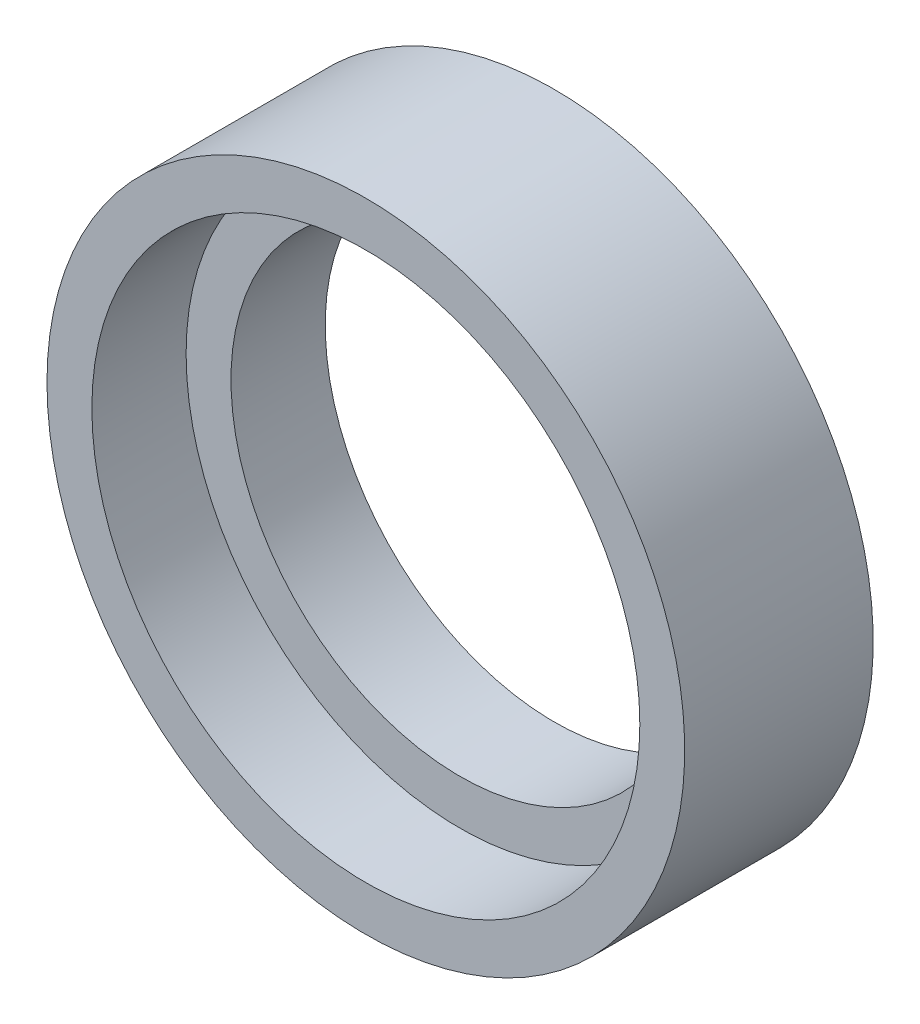
ISO-10303-21;
HEADER;
FILE_DESCRIPTION(('STEP AP214'),'2;1');
FILE_NAME('part.step','',(''),(''),'','','');
FILE_SCHEMA(('AUTOMOTIVE_DESIGN { 1 0 10303 214 1 1 1 1 }'));
ENDSEC;
DATA;
#1=APPLICATION_CONTEXT('core data for automotive mechanical design processes');
#2=APPLICATION_PROTOCOL_DEFINITION('international standard','automotive_design',2000,#1);
#3=PRODUCT_CONTEXT('',#1,'mechanical');
#4=PRODUCT('Part','Part','',(#3));
#5=PRODUCT_RELATED_PRODUCT_CATEGORY('part','',(#4));
#6=PRODUCT_DEFINITION_FORMATION('','',#4);
#7=PRODUCT_DEFINITION_CONTEXT('part definition',#1,'design');
#8=PRODUCT_DEFINITION('design','',#6,#7);
#9=PRODUCT_DEFINITION_SHAPE('','',#8);
#10=(LENGTH_UNIT() NAMED_UNIT(*) SI_UNIT(.MILLI.,.METRE.));
#11=(NAMED_UNIT(*) PLANE_ANGLE_UNIT() SI_UNIT($,.RADIAN.));
#12=(NAMED_UNIT(*) SI_UNIT($,.STERADIAN.) SOLID_ANGLE_UNIT());
#13=UNCERTAINTY_MEASURE_WITH_UNIT(LENGTH_MEASURE(1.E-05),#10,'distance_accuracy_value','');
#14=(GEOMETRIC_REPRESENTATION_CONTEXT(3) GLOBAL_UNCERTAINTY_ASSIGNED_CONTEXT((#13)) GLOBAL_UNIT_ASSIGNED_CONTEXT((#10,
#11,#12)) REPRESENTATION_CONTEXT('',''));
#15=CARTESIAN_POINT('',(0.,0.,0.));
#16=DIRECTION('',(0.,0.,1.));
#17=DIRECTION('',(1.,0.,0.));
#18=AXIS2_PLACEMENT_3D('',#15,#16,#17);
#19=CARTESIAN_POINT('',(0.,0.,21.));
#20=DIRECTION('',(0.,0.,1.));
#21=DIRECTION('',(1.,0.,0.));
#22=AXIS2_PLACEMENT_3D('',#19,#20,#21);
#23=PLANE('',#22);
#24=CARTESIAN_POINT('',(0.,0.,21.));
#25=DIRECTION('',(0.,0.,1.));
#26=DIRECTION('',(1.,0.,0.));
#27=AXIS2_PLACEMENT_3D('',#24,#25,#26);
#28=CIRCLE('',#27,71.05);
#29=CARTESIAN_POINT('',(-71.05,0.,21.));
#30=VERTEX_POINT('',#29);
#31=EDGE_CURVE('E10',#30,#30,#28,.T.);
#32=ORIENTED_EDGE('',*,*,#31,.T.);
#33=EDGE_LOOP('',(#32));
#34=FACE_BOUND('',#33,.T.);
#35=CARTESIAN_POINT('',(0.,0.,21.));
#36=DIRECTION('',(0.,0.,1.));
#37=DIRECTION('',(1.,0.,0.));
#38=AXIS2_PLACEMENT_3D('',#35,#36,#37);
#39=CIRCLE('',#38,61.05);
#40=CARTESIAN_POINT('',(-61.05,0.,21.));
#41=VERTEX_POINT('',#40);
#42=EDGE_CURVE('E42',#41,#41,#39,.T.);
#43=ORIENTED_EDGE('',*,*,#42,.F.);
#44=EDGE_LOOP('',(#43));
#45=FACE_BOUND('',#44,.T.);
#46=ADVANCED_FACE('F35',(#34,#45),#23,.T.);
#47=CARTESIAN_POINT('',(0.,0.,21.));
#48=DIRECTION('',(0.,0.,-1.));
#49=DIRECTION('',(-1.,0.,0.));
#50=AXIS2_PLACEMENT_3D('',#47,#48,#49);
#51=CYLINDRICAL_SURFACE('',#50,71.05);
#52=CARTESIAN_POINT('',(0.,0.,-21.));
#53=DIRECTION('',(0.,0.,-1.));
#54=DIRECTION('',(-1.,0.,0.));
#55=AXIS2_PLACEMENT_3D('',#52,#53,#54);
#56=CIRCLE('',#55,71.05);
#57=CARTESIAN_POINT('',(-71.05,0.,-21.));
#58=VERTEX_POINT('',#57);
#59=EDGE_CURVE('E51',#58,#58,#56,.T.);
#60=CARTESIAN_POINT('',(-71.05,0.,21.));
#61=CARTESIAN_POINT('',(-71.05,0.,20.5625));
#62=CARTESIAN_POINT('',(-71.05,0.,20.125));
#63=CARTESIAN_POINT('',(-71.05,0.,19.25));
#64=CARTESIAN_POINT('',(-71.05,0.,18.8125));
#65=CARTESIAN_POINT('',(-71.05,0.,17.9375));
#66=CARTESIAN_POINT('',(-71.05,0.,17.5));
#67=CARTESIAN_POINT('',(-71.05,0.,16.625));
#68=CARTESIAN_POINT('',(-71.05,0.,16.1875));
#69=CARTESIAN_POINT('',(-71.05,0.,15.3125));
#70=CARTESIAN_POINT('',(-71.05,0.,14.875));
#71=CARTESIAN_POINT('',(-71.05,0.,14.));
#72=CARTESIAN_POINT('',(-71.05,0.,13.5625));
#73=CARTESIAN_POINT('',(-71.05,0.,12.6875));
#74=CARTESIAN_POINT('',(-71.05,0.,12.25));
#75=CARTESIAN_POINT('',(-71.05,0.,11.375));
#76=CARTESIAN_POINT('',(-71.05,0.,10.9375));
#77=CARTESIAN_POINT('',(-71.05,0.,10.0625));
#78=CARTESIAN_POINT('',(-71.05,0.,9.625));
#79=CARTESIAN_POINT('',(-71.05,0.,8.75));
#80=CARTESIAN_POINT('',(-71.05,0.,8.3125));
#81=CARTESIAN_POINT('',(-71.05,0.,7.4375));
#82=CARTESIAN_POINT('',(-71.05,0.,7.));
#83=CARTESIAN_POINT('',(-71.05,0.,6.125));
#84=CARTESIAN_POINT('',(-71.05,0.,5.6875));
#85=CARTESIAN_POINT('',(-71.05,0.,4.8125));
#86=CARTESIAN_POINT('',(-71.05,0.,4.375));
#87=CARTESIAN_POINT('',(-71.05,0.,3.5));
#88=CARTESIAN_POINT('',(-71.05,0.,3.0625));
#89=CARTESIAN_POINT('',(-71.05,0.,2.1875));
#90=CARTESIAN_POINT('',(-71.05,0.,1.75));
#91=CARTESIAN_POINT('',(-71.05,0.,0.874999999999997));
#92=CARTESIAN_POINT('',(-71.05,0.,0.437499999999997));
#93=CARTESIAN_POINT('',(-71.05,0.,-0.437500000000004));
#94=CARTESIAN_POINT('',(-71.05,0.,-0.875000000000004));
#95=CARTESIAN_POINT('',(-71.05,0.,-1.75000000000001));
#96=CARTESIAN_POINT('',(-71.05,0.,-2.18750000000001));
#97=CARTESIAN_POINT('',(-71.05,0.,-3.0625));
#98=CARTESIAN_POINT('',(-71.05,0.,-3.5));
#99=CARTESIAN_POINT('',(-71.05,0.,-4.375));
#100=CARTESIAN_POINT('',(-71.05,0.,-4.8125));
#101=CARTESIAN_POINT('',(-71.05,0.,-5.68750000000001));
#102=CARTESIAN_POINT('',(-71.05,0.,-6.12500000000001));
#103=CARTESIAN_POINT('',(-71.05,0.,-7.00000000000001));
#104=CARTESIAN_POINT('',(-71.05,0.,-7.4375));
#105=CARTESIAN_POINT('',(-71.05,0.,-8.3125));
#106=CARTESIAN_POINT('',(-71.05,0.,-8.75));
#107=CARTESIAN_POINT('',(-71.05,0.,-9.625));
#108=CARTESIAN_POINT('',(-71.05,0.,-10.0625));
#109=CARTESIAN_POINT('',(-71.05,0.,-10.9375));
#110=CARTESIAN_POINT('',(-71.05,0.,-11.375));
#111=CARTESIAN_POINT('',(-71.05,0.,-12.25));
#112=CARTESIAN_POINT('',(-71.05,0.,-12.6875));
#113=CARTESIAN_POINT('',(-71.05,0.,-13.5625));
#114=CARTESIAN_POINT('',(-71.05,0.,-14.));
#115=CARTESIAN_POINT('',(-71.05,0.,-14.875));
#116=CARTESIAN_POINT('',(-71.05,0.,-15.3125));
#117=CARTESIAN_POINT('',(-71.05,0.,-16.1875));
#118=CARTESIAN_POINT('',(-71.05,0.,-16.625));
#119=CARTESIAN_POINT('',(-71.05,0.,-17.5));
#120=CARTESIAN_POINT('',(-71.05,0.,-17.9375));
#121=CARTESIAN_POINT('',(-71.05,0.,-18.8125));
#122=CARTESIAN_POINT('',(-71.05,0.,-19.25));
#123=CARTESIAN_POINT('',(-71.05,0.,-20.125));
#124=CARTESIAN_POINT('',(-71.05,0.,-20.5625));
#125=CARTESIAN_POINT('',(-71.05,0.,-21.));
#126=B_SPLINE_CURVE_WITH_KNOTS('',3,(#60,#61,#62,#63,#64,#65,#66,#67,#68,#69,#70,#71,#72,#73,
#74,#75,#76,#77,#78,#79,#80,#81,#82,#83,#84,#85,#86,#87,#88,#89,#90,#91,#92,#93,#94,#95,#96,#97,
#98,#99,#100,#101,#102,#103,#104,#105,#106,#107,#108,#109,#110,#111,#112,#113,#114,#115,#116,
#117,#118,#119,#120,#121,#122,#123,#124,#125),.UNSPECIFIED.,.F.,.F.,(4,2,2,2,2,2,2,2,2,2,2,2,2,
2,2,2,2,2,2,2,2,2,2,2,2,2,2,2,2,2,2,2,4),(0.,1.3125,2.625,3.9375,5.25,6.5625,7.875,9.1875,10.5,
11.8125,13.125,14.4375,15.75,17.0625,18.375,19.6875,21.,22.3125,23.625,24.9375,26.25,27.5625,
28.875,30.1875,31.5,32.8125,34.125,35.4375,36.75,38.0625,39.375,40.6875,42.),.UNSPECIFIED.);
#127=EDGE_CURVE('BSEAM37',#30,#58,#126,.T.);
#128=ORIENTED_EDGE('',*,*,#31,.F.);
#129=ORIENTED_EDGE('',*,*,#59,.F.);
#130=ORIENTED_EDGE('',*,*,#127,.T.);
#131=ORIENTED_EDGE('',*,*,#127,.F.);
#132=EDGE_LOOP('',(#128,#130,#129,#131));
#133=FACE_BOUND('',#132,.T.);
#134=ADVANCED_FACE('F37',(#133),#51,.T.);
#135=CARTESIAN_POINT('',(0.,0.,21.));
#136=DIRECTION('',(0.,0.,-1.));
#137=DIRECTION('',(-1.,0.,0.));
#138=AXIS2_PLACEMENT_3D('',#135,#136,#137);
#139=CYLINDRICAL_SURFACE('',#138,61.05);
#140=CARTESIAN_POINT('',(0.,0.,0.));
#141=DIRECTION('',(0.,0.,1.));
#142=DIRECTION('',(1.,0.,0.));
#143=AXIS2_PLACEMENT_3D('',#140,#141,#142);
#144=CIRCLE('',#143,61.05);
#145=CARTESIAN_POINT('',(-61.05,0.,0.));
#146=VERTEX_POINT('',#145);
#147=EDGE_CURVE('E46',#146,#146,#144,.T.);
#148=CARTESIAN_POINT('',(-61.05,0.,21.));
#149=CARTESIAN_POINT('',(-61.05,0.,20.78125));
#150=CARTESIAN_POINT('',(-61.05,0.,20.5625));
#151=CARTESIAN_POINT('',(-61.05,0.,20.125));
#152=CARTESIAN_POINT('',(-61.05,0.,19.90625));
#153=CARTESIAN_POINT('',(-61.05,0.,19.46875));
#154=CARTESIAN_POINT('',(-61.05,0.,19.25));
#155=CARTESIAN_POINT('',(-61.05,0.,18.8125));
#156=CARTESIAN_POINT('',(-61.05,0.,18.59375));
#157=CARTESIAN_POINT('',(-61.05,0.,18.15625));
#158=CARTESIAN_POINT('',(-61.05,0.,17.9375));
#159=CARTESIAN_POINT('',(-61.05,0.,17.5));
#160=CARTESIAN_POINT('',(-61.05,0.,17.28125));
#161=CARTESIAN_POINT('',(-61.05,0.,16.84375));
#162=CARTESIAN_POINT('',(-61.05,0.,16.625));
#163=CARTESIAN_POINT('',(-61.05,0.,16.1875));
#164=CARTESIAN_POINT('',(-61.05,0.,15.96875));
#165=CARTESIAN_POINT('',(-61.05,0.,15.53125));
#166=CARTESIAN_POINT('',(-61.05,0.,15.3125));
#167=CARTESIAN_POINT('',(-61.05,0.,14.875));
#168=CARTESIAN_POINT('',(-61.05,0.,14.65625));
#169=CARTESIAN_POINT('',(-61.05,0.,14.21875));
#170=CARTESIAN_POINT('',(-61.05,0.,14.));
#171=CARTESIAN_POINT('',(-61.05,0.,13.5625));
#172=CARTESIAN_POINT('',(-61.05,0.,13.34375));
#173=CARTESIAN_POINT('',(-61.05,0.,12.90625));
#174=CARTESIAN_POINT('',(-61.05,0.,12.6875));
#175=CARTESIAN_POINT('',(-61.05,0.,12.25));
#176=CARTESIAN_POINT('',(-61.05,0.,12.03125));
#177=CARTESIAN_POINT('',(-61.05,0.,11.59375));
#178=CARTESIAN_POINT('',(-61.05,0.,11.375));
#179=CARTESIAN_POINT('',(-61.05,0.,10.9375));
#180=CARTESIAN_POINT('',(-61.05,0.,10.71875));
#181=CARTESIAN_POINT('',(-61.05,0.,10.28125));
#182=CARTESIAN_POINT('',(-61.05,0.,10.0625));
#183=CARTESIAN_POINT('',(-61.05,0.,9.625));
#184=CARTESIAN_POINT('',(-61.05,0.,9.40625));
#185=CARTESIAN_POINT('',(-61.05,0.,8.96875));
#186=CARTESIAN_POINT('',(-61.05,0.,8.75));
#187=CARTESIAN_POINT('',(-61.05,0.,8.3125));
#188=CARTESIAN_POINT('',(-61.05,0.,8.09375));
#189=CARTESIAN_POINT('',(-61.05,0.,7.65625));
#190=CARTESIAN_POINT('',(-61.05,0.,7.4375));
#191=CARTESIAN_POINT('',(-61.05,0.,7.));
#192=CARTESIAN_POINT('',(-61.05,0.,6.78125));
#193=CARTESIAN_POINT('',(-61.05,0.,6.34375));
#194=CARTESIAN_POINT('',(-61.05,0.,6.125));
#195=CARTESIAN_POINT('',(-61.05,0.,5.6875));
#196=CARTESIAN_POINT('',(-61.05,0.,5.46875));
#197=CARTESIAN_POINT('',(-61.05,0.,5.03125));
#198=CARTESIAN_POINT('',(-61.05,0.,4.8125));
#199=CARTESIAN_POINT('',(-61.05,0.,4.375));
#200=CARTESIAN_POINT('',(-61.05,0.,4.15625));
#201=CARTESIAN_POINT('',(-61.05,0.,3.71875));
#202=CARTESIAN_POINT('',(-61.05,0.,3.5));
#203=CARTESIAN_POINT('',(-61.05,0.,3.0625));
#204=CARTESIAN_POINT('',(-61.05,0.,2.84375));
#205=CARTESIAN_POINT('',(-61.05,0.,2.40625));
#206=CARTESIAN_POINT('',(-61.05,0.,2.1875));
#207=CARTESIAN_POINT('',(-61.05,0.,1.75));
#208=CARTESIAN_POINT('',(-61.05,0.,1.53125));
#209=CARTESIAN_POINT('',(-61.05,0.,1.09375));
#210=CARTESIAN_POINT('',(-61.05,0.,0.875000000000001));
#211=CARTESIAN_POINT('',(-61.05,0.,0.4375));
#212=CARTESIAN_POINT('',(-61.05,0.,0.21875));
#213=CARTESIAN_POINT('',(-61.05,0.,0.));
#214=B_SPLINE_CURVE_WITH_KNOTS('',3,(#148,#149,#150,#151,#152,#153,#154,#155,#156,#157,#158,
#159,#160,#161,#162,#163,#164,#165,#166,#167,#168,#169,#170,#171,#172,#173,#174,#175,#176,#177,
#178,#179,#180,#181,#182,#183,#184,#185,#186,#187,#188,#189,#190,#191,#192,#193,#194,#195,#196,
#197,#198,#199,#200,#201,#202,#203,#204,#205,#206,#207,#208,#209,#210,#211,#212,#213),
.UNSPECIFIED.,.F.,.F.,(4,2,2,2,2,2,2,2,2,2,2,2,2,2,2,2,2,2,2,2,2,2,2,2,2,2,2,2,2,2,2,2,4),(0.,
0.656250000000001,1.3125,1.96875,2.625,3.28125,3.9375,4.59375,5.25,5.90625,6.5625,7.21875,7.875,
8.53125,9.1875,9.84375,10.5,11.15625,11.8125,12.46875,13.125,13.78125,14.4375,15.09375,15.75,
16.40625,17.0625,17.71875,18.375,19.03125,19.6875,20.34375,21.),.UNSPECIFIED.);
#215=EDGE_CURVE('BSEAM75',#41,#146,#214,.T.);
#216=ORIENTED_EDGE('',*,*,#42,.T.);
#217=ORIENTED_EDGE('',*,*,#147,.F.);
#218=ORIENTED_EDGE('',*,*,#215,.T.);
#219=ORIENTED_EDGE('',*,*,#215,.F.);
#220=EDGE_LOOP('',(#216,#218,#217,#219));
#221=FACE_BOUND('',#220,.T.);
#222=ADVANCED_FACE('F75',(#221),#139,.F.);
#223=CARTESIAN_POINT('',(0.,0.,0.));
#224=DIRECTION('',(0.,0.,-1.));
#225=DIRECTION('',(-1.,0.,0.));
#226=AXIS2_PLACEMENT_3D('',#223,#224,#225);
#227=PLANE('',#226);
#228=CARTESIAN_POINT('',(0.,0.,0.));
#229=DIRECTION('',(0.,0.,-1.));
#230=DIRECTION('',(-1.,0.,0.));
#231=AXIS2_PLACEMENT_3D('',#228,#229,#230);
#232=CIRCLE('',#231,51.05);
#233=CARTESIAN_POINT('',(51.05,0.,0.));
#234=VERTEX_POINT('',#233);
#235=EDGE_CURVE('E56',#234,#234,#232,.T.);
#236=ORIENTED_EDGE('',*,*,#235,.T.);
#237=EDGE_LOOP('',(#236));
#238=FACE_BOUND('',#237,.T.);
#239=ORIENTED_EDGE('',*,*,#147,.T.);
#240=EDGE_LOOP('',(#239));
#241=FACE_BOUND('',#240,.T.);
#242=ADVANCED_FACE('F67',(#238,#241),#227,.F.);
#243=CARTESIAN_POINT('',(0.,0.,-21.));
#244=DIRECTION('',(0.,0.,-1.));
#245=DIRECTION('',(-1.,0.,0.));
#246=AXIS2_PLACEMENT_3D('',#243,#244,#245);
#247=PLANE('',#246);
#248=ORIENTED_EDGE('',*,*,#59,.T.);
#249=EDGE_LOOP('',(#248));
#250=FACE_BOUND('',#249,.T.);
#251=CARTESIAN_POINT('',(0.,0.,-21.));
#252=DIRECTION('',(0.,0.,-1.));
#253=DIRECTION('',(-1.,0.,0.));
#254=AXIS2_PLACEMENT_3D('',#251,#252,#253);
#255=CIRCLE('',#254,51.05);
#256=CARTESIAN_POINT('',(51.05,0.,-21.));
#257=VERTEX_POINT('',#256);
#258=EDGE_CURVE('E55',#257,#257,#255,.T.);
#259=ORIENTED_EDGE('',*,*,#258,.F.);
#260=EDGE_LOOP('',(#259));
#261=FACE_BOUND('',#260,.T.);
#262=ADVANCED_FACE('F65',(#250,#261),#247,.T.);
#263=CARTESIAN_POINT('',(0.,0.,-21.));
#264=DIRECTION('',(0.,0.,1.));
#265=DIRECTION('',(1.,0.,0.));
#266=AXIS2_PLACEMENT_3D('',#263,#264,#265);
#267=CYLINDRICAL_SURFACE('',#266,51.05);
#268=CARTESIAN_POINT('',(51.05,0.,-21.));
#269=CARTESIAN_POINT('',(51.05,0.,-20.78125));
#270=CARTESIAN_POINT('',(51.05,0.,-20.5625));
#271=CARTESIAN_POINT('',(51.05,0.,-20.125));
#272=CARTESIAN_POINT('',(51.05,0.,-19.90625));
#273=CARTESIAN_POINT('',(51.05,0.,-19.46875));
#274=CARTESIAN_POINT('',(51.05,0.,-19.25));
#275=CARTESIAN_POINT('',(51.05,0.,-18.8125));
#276=CARTESIAN_POINT('',(51.05,0.,-18.59375));
#277=CARTESIAN_POINT('',(51.05,0.,-18.15625));
#278=CARTESIAN_POINT('',(51.05,0.,-17.9375));
#279=CARTESIAN_POINT('',(51.05,0.,-17.5));
#280=CARTESIAN_POINT('',(51.05,0.,-17.28125));
#281=CARTESIAN_POINT('',(51.05,0.,-16.84375));
#282=CARTESIAN_POINT('',(51.05,0.,-16.625));
#283=CARTESIAN_POINT('',(51.05,0.,-16.1875));
#284=CARTESIAN_POINT('',(51.05,0.,-15.96875));
#285=CARTESIAN_POINT('',(51.05,0.,-15.53125));
#286=CARTESIAN_POINT('',(51.05,0.,-15.3125));
#287=CARTESIAN_POINT('',(51.05,0.,-14.875));
#288=CARTESIAN_POINT('',(51.05,0.,-14.65625));
#289=CARTESIAN_POINT('',(51.05,0.,-14.21875));
#290=CARTESIAN_POINT('',(51.05,0.,-14.));
#291=CARTESIAN_POINT('',(51.05,0.,-13.5625));
#292=CARTESIAN_POINT('',(51.05,0.,-13.34375));
#293=CARTESIAN_POINT('',(51.05,0.,-12.90625));
#294=CARTESIAN_POINT('',(51.05,0.,-12.6875));
#295=CARTESIAN_POINT('',(51.05,0.,-12.25));
#296=CARTESIAN_POINT('',(51.05,0.,-12.03125));
#297=CARTESIAN_POINT('',(51.05,0.,-11.59375));
#298=CARTESIAN_POINT('',(51.05,0.,-11.375));
#299=CARTESIAN_POINT('',(51.05,0.,-10.9375));
#300=CARTESIAN_POINT('',(51.05,0.,-10.71875));
#301=CARTESIAN_POINT('',(51.05,0.,-10.28125));
#302=CARTESIAN_POINT('',(51.05,0.,-10.0625));
#303=CARTESIAN_POINT('',(51.05,0.,-9.625));
#304=CARTESIAN_POINT('',(51.05,0.,-9.40625));
#305=CARTESIAN_POINT('',(51.05,0.,-8.96875));
#306=CARTESIAN_POINT('',(51.05,0.,-8.75));
#307=CARTESIAN_POINT('',(51.05,0.,-8.3125));
#308=CARTESIAN_POINT('',(51.05,0.,-8.09375));
#309=CARTESIAN_POINT('',(51.05,0.,-7.65625));
#310=CARTESIAN_POINT('',(51.05,0.,-7.4375));
#311=CARTESIAN_POINT('',(51.05,0.,-7.));
#312=CARTESIAN_POINT('',(51.05,0.,-6.78125));
#313=CARTESIAN_POINT('',(51.05,0.,-6.34375));
#314=CARTESIAN_POINT('',(51.05,0.,-6.125));
#315=CARTESIAN_POINT('',(51.05,0.,-5.6875));
#316=CARTESIAN_POINT('',(51.05,0.,-5.46875));
#317=CARTESIAN_POINT('',(51.05,0.,-5.03125));
#318=CARTESIAN_POINT('',(51.05,0.,-4.8125));
#319=CARTESIAN_POINT('',(51.05,0.,-4.375));
#320=CARTESIAN_POINT('',(51.05,0.,-4.15625));
#321=CARTESIAN_POINT('',(51.05,0.,-3.71875));
#322=CARTESIAN_POINT('',(51.05,0.,-3.5));
#323=CARTESIAN_POINT('',(51.05,0.,-3.0625));
#324=CARTESIAN_POINT('',(51.05,0.,-2.84375));
#325=CARTESIAN_POINT('',(51.05,0.,-2.40625));
#326=CARTESIAN_POINT('',(51.05,0.,-2.1875));
#327=CARTESIAN_POINT('',(51.05,0.,-1.75));
#328=CARTESIAN_POINT('',(51.05,0.,-1.53125));
#329=CARTESIAN_POINT('',(51.05,0.,-1.09375));
#330=CARTESIAN_POINT('',(51.05,0.,-0.875000000000001));
#331=CARTESIAN_POINT('',(51.05,0.,-0.4375));
#332=CARTESIAN_POINT('',(51.05,0.,-0.21875));
#333=CARTESIAN_POINT('',(51.05,0.,0.));
#334=B_SPLINE_CURVE_WITH_KNOTS('',3,(#268,#269,#270,#271,#272,#273,#274,#275,#276,#277,#278,
#279,#280,#281,#282,#283,#284,#285,#286,#287,#288,#289,#290,#291,#292,#293,#294,#295,#296,#297,
#298,#299,#300,#301,#302,#303,#304,#305,#306,#307,#308,#309,#310,#311,#312,#313,#314,#315,#316,
#317,#318,#319,#320,#321,#322,#323,#324,#325,#326,#327,#328,#329,#330,#331,#332,#333),
.UNSPECIFIED.,.F.,.F.,(4,2,2,2,2,2,2,2,2,2,2,2,2,2,2,2,2,2,2,2,2,2,2,2,2,2,2,2,2,2,2,2,4),(0.,
0.656250000000001,1.3125,1.96875,2.625,3.28125,3.9375,4.59375,5.25,5.90625,6.5625,7.21875,7.875,
8.53125,9.1875,9.84375,10.5,11.15625,11.8125,12.46875,13.125,13.78125,14.4375,15.09375,15.75,
16.40625,17.0625,17.71875,18.375,19.03125,19.6875,20.34375,21.),.UNSPECIFIED.);
#335=EDGE_CURVE('BSEAM62',#257,#234,#334,.T.);
#336=ORIENTED_EDGE('',*,*,#258,.T.);
#337=ORIENTED_EDGE('',*,*,#235,.F.);
#338=ORIENTED_EDGE('',*,*,#335,.T.);
#339=ORIENTED_EDGE('',*,*,#335,.F.);
#340=EDGE_LOOP('',(#336,#338,#337,#339));
#341=FACE_BOUND('',#340,.T.);
#342=ADVANCED_FACE('F62',(#341),#267,.F.);
#343=CLOSED_SHELL('',(#46,#134,#222,#242,#262,#342));
#344=MANIFOLD_SOLID_BREP('B2',#343);
#345=ADVANCED_BREP_SHAPE_REPRESENTATION('',(#18,#344),#14);
#346=SHAPE_DEFINITION_REPRESENTATION(#9,#345);
ENDSEC;
END-ISO-10303-21;
